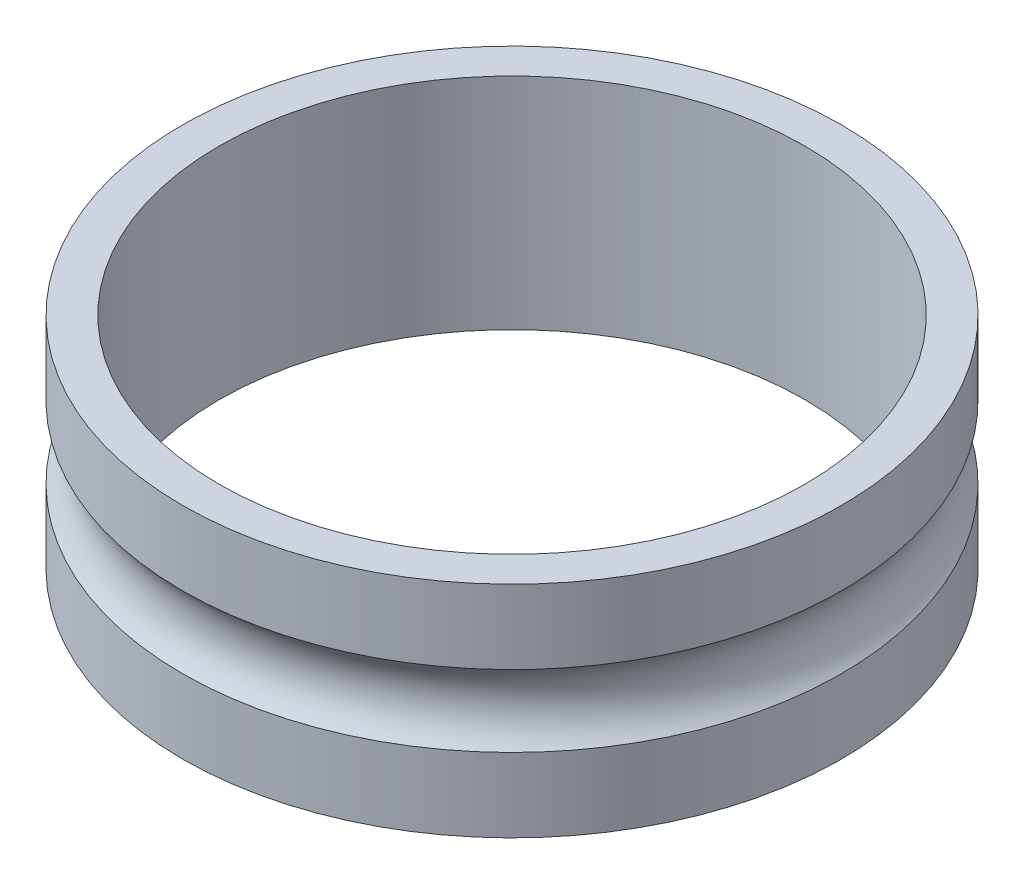
ISO-10303-21;
HEADER;
FILE_DESCRIPTION(('STEP AP214'),'2;1');
FILE_NAME('part.step','',(''),(''),'','','');
FILE_SCHEMA(('AUTOMOTIVE_DESIGN { 1 0 10303 214 1 1 1 1 }'));
ENDSEC;
DATA;
#1=APPLICATION_CONTEXT('core data for automotive mechanical design processes');
#2=APPLICATION_PROTOCOL_DEFINITION('international standard','automotive_design',2000,#1);
#3=PRODUCT_CONTEXT('',#1,'mechanical');
#4=PRODUCT('Part','Part','',(#3));
#5=PRODUCT_RELATED_PRODUCT_CATEGORY('part','',(#4));
#6=PRODUCT_DEFINITION_FORMATION('','',#4);
#7=PRODUCT_DEFINITION_CONTEXT('part definition',#1,'design');
#8=PRODUCT_DEFINITION('design','',#6,#7);
#9=PRODUCT_DEFINITION_SHAPE('','',#8);
#10=(LENGTH_UNIT() NAMED_UNIT(*) SI_UNIT(.MILLI.,.METRE.));
#11=(NAMED_UNIT(*) PLANE_ANGLE_UNIT() SI_UNIT($,.RADIAN.));
#12=(NAMED_UNIT(*) SI_UNIT($,.STERADIAN.) SOLID_ANGLE_UNIT());
#13=UNCERTAINTY_MEASURE_WITH_UNIT(LENGTH_MEASURE(1.E-05),#10,'distance_accuracy_value','');
#14=(GEOMETRIC_REPRESENTATION_CONTEXT(3) GLOBAL_UNCERTAINTY_ASSIGNED_CONTEXT((#13)) GLOBAL_UNIT_ASSIGNED_CONTEXT((#10,
#11,#12)) REPRESENTATION_CONTEXT('',''));
#15=CARTESIAN_POINT('',(0.,0.,0.));
#16=DIRECTION('',(0.,0.,1.));
#17=DIRECTION('',(1.,0.,0.));
#18=AXIS2_PLACEMENT_3D('',#15,#16,#17);
#19=CARTESIAN_POINT('',(0.,1.5,0.));
#20=DIRECTION('',(0.,-1.,0.));
#21=DIRECTION('',(0.,0.,-1.));
#22=AXIS2_PLACEMENT_3D('',#19,#20,#21);
#23=CYLINDRICAL_SURFACE('',#22,4.5);
#24=CARTESIAN_POINT('',(0.,1.5,0.));
#25=DIRECTION('',(0.,1.,0.));
#26=DIRECTION('',(0.,0.,1.));
#27=AXIS2_PLACEMENT_3D('',#24,#25,#26);
#28=CIRCLE('',#27,4.5);
#29=CARTESIAN_POINT('',(0.,1.5,4.5));
#30=VERTEX_POINT('',#29);
#31=EDGE_CURVE('E10',#30,#30,#28,.T.);
#32=ORIENTED_EDGE('',*,*,#31,.F.);
#33=EDGE_LOOP('',(#32));
#34=FACE_BOUND('',#33,.T.);
#35=CARTESIAN_POINT('',(0.,0.489897948556635,0.));
#36=DIRECTION('',(0.,-1.,0.));
#37=DIRECTION('',(0.,0.,-1.));
#38=AXIS2_PLACEMENT_3D('',#35,#36,#37);
#39=CIRCLE('',#38,4.5);
#40=CARTESIAN_POINT('',(0.,0.489897948556635,-4.5));
#41=VERTEX_POINT('',#40);
#42=EDGE_CURVE('E42',#41,#41,#39,.T.);
#43=ORIENTED_EDGE('',*,*,#42,.F.);
#44=EDGE_LOOP('',(#43));
#45=FACE_BOUND('',#44,.T.);
#46=ADVANCED_FACE('F39',(#34,#45),#23,.T.);
#47=CARTESIAN_POINT('',(0.,-1.5,0.));
#48=DIRECTION('',(0.,1.,0.));
#49=DIRECTION('',(0.,0.,1.));
#50=AXIS2_PLACEMENT_3D('',#47,#48,#49);
#51=CIRCLE('',#50,4.5);
#52=CARTESIAN_POINT('',(0.,-1.5,4.5));
#53=VERTEX_POINT('',#52);
#54=EDGE_CURVE('E47',#53,#53,#51,.T.);
#55=ORIENTED_EDGE('',*,*,#54,.T.);
#56=EDGE_LOOP('',(#55));
#57=FACE_BOUND('',#56,.T.);
#58=CARTESIAN_POINT('',(0.,-0.489897948556635,0.));
#59=DIRECTION('',(0.,1.,0.));
#60=DIRECTION('',(0.,0.,1.));
#61=AXIS2_PLACEMENT_3D('',#58,#59,#60);
#62=CIRCLE('',#61,4.5);
#63=CARTESIAN_POINT('',(0.,-0.489897948556635,4.5));
#64=VERTEX_POINT('',#63);
#65=EDGE_CURVE('E58',#64,#64,#62,.T.);
#66=ORIENTED_EDGE('',*,*,#65,.F.);
#67=EDGE_LOOP('',(#66));
#68=FACE_BOUND('',#67,.T.);
#69=ADVANCED_FACE('F81',(#57,#68),#23,.T.);
#70=CARTESIAN_POINT('',(0.,1.5,0.));
#71=DIRECTION('',(0.,1.,0.));
#72=DIRECTION('',(0.,0.,1.));
#73=AXIS2_PLACEMENT_3D('',#70,#71,#72);
#74=PLANE('',#73);
#75=ORIENTED_EDGE('',*,*,#31,.T.);
#76=EDGE_LOOP('',(#75));
#77=FACE_BOUND('',#76,.T.);
#78=CARTESIAN_POINT('',(0.,1.5,0.));
#79=DIRECTION('',(0.,1.,0.));
#80=DIRECTION('',(0.,0.,1.));
#81=AXIS2_PLACEMENT_3D('',#78,#79,#80);
#82=CIRCLE('',#81,4.);
#83=CARTESIAN_POINT('',(0.,1.5,4.));
#84=VERTEX_POINT('',#83);
#85=EDGE_CURVE('E53',#84,#84,#82,.T.);
#86=ORIENTED_EDGE('',*,*,#85,.F.);
#87=EDGE_LOOP('',(#86));
#88=FACE_BOUND('',#87,.T.);
#89=ADVANCED_FACE('F78',(#77,#88),#74,.T.);
#90=CARTESIAN_POINT('',(0.,-1.5,0.));
#91=DIRECTION('',(0.,1.,0.));
#92=DIRECTION('',(0.,0.,1.));
#93=AXIS2_PLACEMENT_3D('',#90,#91,#92);
#94=PLANE('',#93);
#95=ORIENTED_EDGE('',*,*,#54,.F.);
#96=EDGE_LOOP('',(#95));
#97=FACE_BOUND('',#96,.T.);
#98=CARTESIAN_POINT('',(0.,-1.5,0.));
#99=DIRECTION('',(0.,1.,0.));
#100=DIRECTION('',(0.,0.,1.));
#101=AXIS2_PLACEMENT_3D('',#98,#99,#100);
#102=CIRCLE('',#101,4.);
#103=CARTESIAN_POINT('',(0.,-1.5,4.));
#104=VERTEX_POINT('',#103);
#105=EDGE_CURVE('E56',#104,#104,#102,.T.);
#106=ORIENTED_EDGE('',*,*,#105,.T.);
#107=EDGE_LOOP('',(#106));
#108=FACE_BOUND('',#107,.T.);
#109=ADVANCED_FACE('F80',(#97,#108),#94,.F.);
#110=CARTESIAN_POINT('',(0.,1.5,0.));
#111=DIRECTION('',(0.,-1.,0.));
#112=DIRECTION('',(0.,0.,-1.));
#113=AXIS2_PLACEMENT_3D('',#110,#111,#112);
#114=CYLINDRICAL_SURFACE('',#113,4.);
#115=ORIENTED_EDGE('',*,*,#85,.T.);
#116=EDGE_LOOP('',(#115));
#117=FACE_BOUND('',#116,.T.);
#118=ORIENTED_EDGE('',*,*,#105,.F.);
#119=EDGE_LOOP('',(#118));
#120=FACE_BOUND('',#119,.T.);
#121=ADVANCED_FACE('F75',(#117,#120),#114,.F.);
#122=CARTESIAN_POINT('',(0.,0.,0.));
#123=DIRECTION('',(0.,1.,0.));
#124=DIRECTION('',(0.,0.,1.));
#125=AXIS2_PLACEMENT_3D('',#122,#123,#124);
#126=TOROIDAL_SURFACE('',#125,5.,0.7);
#127=ORIENTED_EDGE('',*,*,#65,.T.);
#128=EDGE_LOOP('',(#127));
#129=FACE_BOUND('',#128,.T.);
#130=ORIENTED_EDGE('',*,*,#42,.T.);
#131=EDGE_LOOP('',(#130));
#132=FACE_BOUND('',#131,.T.);
#133=ADVANCED_FACE('F106',(#129,#132),#126,.F.);
#134=CLOSED_SHELL('',(#46,#69,#89,#109,#121,#133));
#135=MANIFOLD_SOLID_BREP('B2',#134);
#136=ADVANCED_BREP_SHAPE_REPRESENTATION('',(#18,#135),#14);
#137=SHAPE_DEFINITION_REPRESENTATION(#9,#136);
ENDSEC;
END-ISO-10303-21;
